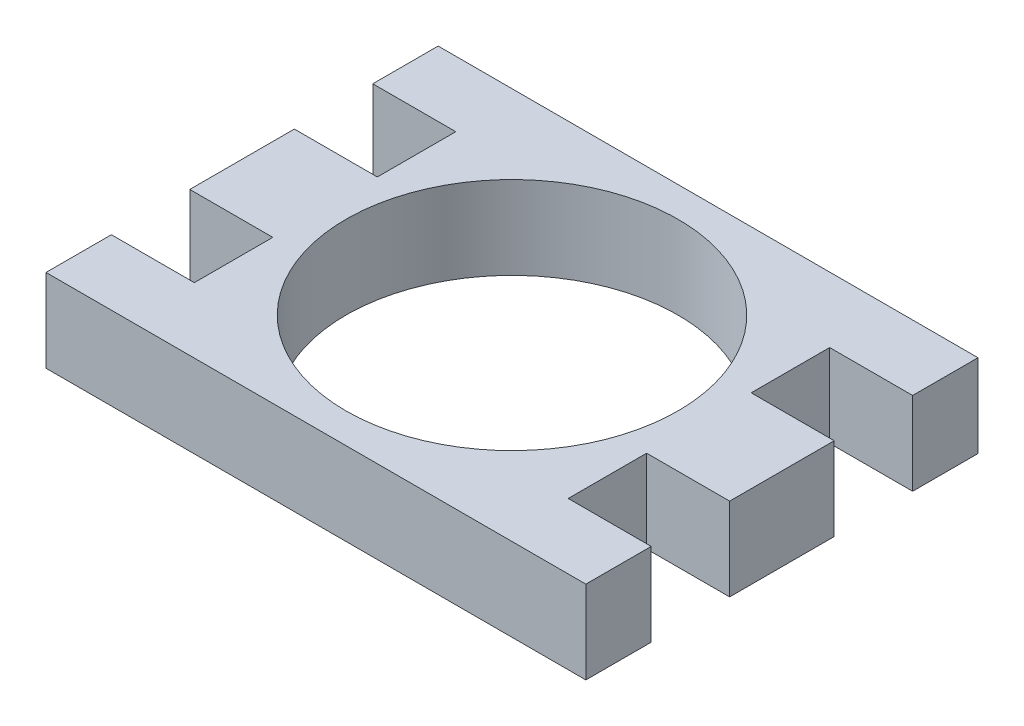
ISO-10303-21;
HEADER;
FILE_DESCRIPTION(('STEP AP214'),'2;1');
FILE_NAME('part.step','',(''),(''),'','','');
FILE_SCHEMA(('AUTOMOTIVE_DESIGN { 1 0 10303 214 1 1 1 1 }'));
ENDSEC;
DATA;
#1=APPLICATION_CONTEXT('core data for automotive mechanical design processes');
#2=APPLICATION_PROTOCOL_DEFINITION('international standard','automotive_design',2000,#1);
#3=PRODUCT_CONTEXT('',#1,'mechanical');
#4=PRODUCT('Part','Part','',(#3));
#5=PRODUCT_RELATED_PRODUCT_CATEGORY('part','',(#4));
#6=PRODUCT_DEFINITION_FORMATION('','',#4);
#7=PRODUCT_DEFINITION_CONTEXT('part definition',#1,'design');
#8=PRODUCT_DEFINITION('design','',#6,#7);
#9=PRODUCT_DEFINITION_SHAPE('','',#8);
#10=(LENGTH_UNIT() NAMED_UNIT(*) SI_UNIT(.MILLI.,.METRE.));
#11=(NAMED_UNIT(*) PLANE_ANGLE_UNIT() SI_UNIT($,.RADIAN.));
#12=(NAMED_UNIT(*) SI_UNIT($,.STERADIAN.) SOLID_ANGLE_UNIT());
#13=UNCERTAINTY_MEASURE_WITH_UNIT(LENGTH_MEASURE(1.E-05),#10,'distance_accuracy_value','');
#14=(GEOMETRIC_REPRESENTATION_CONTEXT(3) GLOBAL_UNCERTAINTY_ASSIGNED_CONTEXT((#13)) GLOBAL_UNIT_ASSIGNED_CONTEXT((#10,
#11,#12)) REPRESENTATION_CONTEXT('',''));
#15=CARTESIAN_POINT('',(0.,0.,0.));
#16=DIRECTION('',(0.,0.,1.));
#17=DIRECTION('',(1.,0.,0.));
#18=AXIS2_PLACEMENT_3D('',#15,#16,#17);
#19=CARTESIAN_POINT('',(0.,6.35,0.));
#20=DIRECTION('',(0.,1.,0.));
#21=DIRECTION('',(0.,0.,1.));
#22=AXIS2_PLACEMENT_3D('',#19,#20,#21);
#23=PLANE('',#22);
#24=DIRECTION('',(0.,0.,-1.));
#25=VECTOR('',#24,1.);
#26=CARTESIAN_POINT('',(20.65,6.35,10.));
#27=LINE('',#26,#25);
#28=CARTESIAN_POINT('',(20.65,6.35,15.));
#29=VERTEX_POINT('',#28);
#30=CARTESIAN_POINT('',(20.65,6.35,10.));
#31=VERTEX_POINT('',#30);
#32=EDGE_CURVE('E241',#29,#31,#27,.T.);
#33=ORIENTED_EDGE('',*,*,#32,.T.);
#34=DIRECTION('',(-1.,0.,0.));
#35=VECTOR('',#34,1.);
#36=CARTESIAN_POINT('',(20.65,6.35,10.));
#37=LINE('',#36,#35);
#38=CARTESIAN_POINT('',(14.3,6.35,9.99999999999999));
#39=VERTEX_POINT('',#38);
#40=EDGE_CURVE('E129',#31,#39,#37,.T.);
#41=ORIENTED_EDGE('',*,*,#40,.T.);
#42=DIRECTION('',(0.,0.,-1.));
#43=VECTOR('',#42,1.);
#44=CARTESIAN_POINT('',(14.3,6.35,9.99999999999999));
#45=LINE('',#44,#43);
#46=CARTESIAN_POINT('',(14.3,6.35,4.));
#47=VERTEX_POINT('',#46);
#48=EDGE_CURVE('E292',#39,#47,#45,.T.);
#49=ORIENTED_EDGE('',*,*,#48,.T.);
#50=DIRECTION('',(1.,0.,0.));
#51=VECTOR('',#50,1.);
#52=CARTESIAN_POINT('',(14.3,6.35,4.));
#53=LINE('',#52,#51);
#54=CARTESIAN_POINT('',(20.65,6.35,4.00000000000001));
#55=VERTEX_POINT('',#54);
#56=EDGE_CURVE('E311',#47,#55,#53,.T.);
#57=ORIENTED_EDGE('',*,*,#56,.T.);
#58=DIRECTION('',(0.,0.,-1.));
#59=VECTOR('',#58,1.);
#60=CARTESIAN_POINT('',(20.65,6.35,-4.00000000000001));
#61=LINE('',#60,#59);
#62=CARTESIAN_POINT('',(20.65,6.35,-4.00000000000001));
#63=VERTEX_POINT('',#62);
#64=EDGE_CURVE('E308',#55,#63,#61,.T.);
#65=ORIENTED_EDGE('',*,*,#64,.T.);
#66=DIRECTION('',(-1.,0.,0.));
#67=VECTOR('',#66,1.);
#68=CARTESIAN_POINT('',(14.3,6.35,-4.));
#69=LINE('',#68,#67);
#70=CARTESIAN_POINT('',(14.3,6.35,-4.));
#71=VERTEX_POINT('',#70);
#72=EDGE_CURVE('E310',#63,#71,#69,.T.);
#73=ORIENTED_EDGE('',*,*,#72,.T.);
#74=DIRECTION('',(0.,0.,-1.));
#75=VECTOR('',#74,1.);
#76=CARTESIAN_POINT('',(14.3,6.35,-9.99999999999999));
#77=LINE('',#76,#75);
#78=CARTESIAN_POINT('',(14.3,6.35,-9.99999999999999));
#79=VERTEX_POINT('',#78);
#80=EDGE_CURVE('E313',#71,#79,#77,.T.);
#81=ORIENTED_EDGE('',*,*,#80,.T.);
#82=DIRECTION('',(1.,0.,0.));
#83=VECTOR('',#82,1.);
#84=CARTESIAN_POINT('',(20.65,6.35,-10.));
#85=LINE('',#84,#83);
#86=CARTESIAN_POINT('',(20.65,6.35,-10.));
#87=VERTEX_POINT('',#86);
#88=EDGE_CURVE('E319',#79,#87,#85,.T.);
#89=ORIENTED_EDGE('',*,*,#88,.T.);
#90=DIRECTION('',(0.,0.,-1.));
#91=VECTOR('',#90,1.);
#92=CARTESIAN_POINT('',(20.65,6.35,-15.));
#93=LINE('',#92,#91);
#94=CARTESIAN_POINT('',(20.65,6.35,-15.));
#95=VERTEX_POINT('',#94);
#96=EDGE_CURVE('E321',#87,#95,#93,.T.);
#97=ORIENTED_EDGE('',*,*,#96,.T.);
#98=DIRECTION('',(-1.,0.,0.));
#99=VECTOR('',#98,1.);
#100=CARTESIAN_POINT('',(-20.65,6.35,-15.));
#101=LINE('',#100,#99);
#102=CARTESIAN_POINT('',(-20.65,6.35,-15.));
#103=VERTEX_POINT('',#102);
#104=EDGE_CURVE('E323',#95,#103,#101,.T.);
#105=ORIENTED_EDGE('',*,*,#104,.T.);
#106=DIRECTION('',(0.,0.,1.));
#107=VECTOR('',#106,1.);
#108=CARTESIAN_POINT('',(-20.65,6.35,-15.));
#109=LINE('',#108,#107);
#110=CARTESIAN_POINT('',(-20.65,6.35,-10.));
#111=VERTEX_POINT('',#110);
#112=EDGE_CURVE('E325',#103,#111,#109,.T.);
#113=ORIENTED_EDGE('',*,*,#112,.T.);
#114=DIRECTION('',(1.,0.,0.));
#115=VECTOR('',#114,1.);
#116=CARTESIAN_POINT('',(-20.65,6.35,-10.));
#117=LINE('',#116,#115);
#118=CARTESIAN_POINT('',(-14.3,6.35,-10.));
#119=VERTEX_POINT('',#118);
#120=EDGE_CURVE('E327',#111,#119,#117,.T.);
#121=ORIENTED_EDGE('',*,*,#120,.T.);
#122=DIRECTION('',(0.,0.,1.));
#123=VECTOR('',#122,1.);
#124=CARTESIAN_POINT('',(-14.3,6.35,-10.));
#125=LINE('',#124,#123);
#126=CARTESIAN_POINT('',(-14.3,6.35,-4.));
#127=VERTEX_POINT('',#126);
#128=EDGE_CURVE('E329',#119,#127,#125,.T.);
#129=ORIENTED_EDGE('',*,*,#128,.T.);
#130=DIRECTION('',(-1.,0.,0.));
#131=VECTOR('',#130,1.);
#132=CARTESIAN_POINT('',(-14.3,6.35,-4.));
#133=LINE('',#132,#131);
#134=CARTESIAN_POINT('',(-20.65,6.35,-4.));
#135=VERTEX_POINT('',#134);
#136=EDGE_CURVE('E331',#127,#135,#133,.T.);
#137=ORIENTED_EDGE('',*,*,#136,.T.);
#138=DIRECTION('',(0.,0.,1.));
#139=VECTOR('',#138,1.);
#140=CARTESIAN_POINT('',(-20.65,6.35,-4.));
#141=LINE('',#140,#139);
#142=CARTESIAN_POINT('',(-20.65,6.35,4.));
#143=VERTEX_POINT('',#142);
#144=EDGE_CURVE('E333',#135,#143,#141,.T.);
#145=ORIENTED_EDGE('',*,*,#144,.T.);
#146=DIRECTION('',(1.,0.,0.));
#147=VECTOR('',#146,1.);
#148=CARTESIAN_POINT('',(-14.3,6.35,4.));
#149=LINE('',#148,#147);
#150=CARTESIAN_POINT('',(-14.3,6.35,4.));
#151=VERTEX_POINT('',#150);
#152=EDGE_CURVE('E335',#143,#151,#149,.T.);
#153=ORIENTED_EDGE('',*,*,#152,.T.);
#154=DIRECTION('',(0.,0.,1.));
#155=VECTOR('',#154,1.);
#156=CARTESIAN_POINT('',(-14.3,6.35,10.));
#157=LINE('',#156,#155);
#158=CARTESIAN_POINT('',(-14.3,6.35,10.));
#159=VERTEX_POINT('',#158);
#160=EDGE_CURVE('E184',#151,#159,#157,.T.);
#161=ORIENTED_EDGE('',*,*,#160,.T.);
#162=DIRECTION('',(-1.,0.,0.));
#163=VECTOR('',#162,1.);
#164=CARTESIAN_POINT('',(-20.65,6.35,10.));
#165=LINE('',#164,#163);
#166=CARTESIAN_POINT('',(-20.65,6.35,10.));
#167=VERTEX_POINT('',#166);
#168=EDGE_CURVE('E178',#159,#167,#165,.T.);
#169=ORIENTED_EDGE('',*,*,#168,.T.);
#170=DIRECTION('',(0.,0.,1.));
#171=VECTOR('',#170,1.);
#172=CARTESIAN_POINT('',(-20.65,6.35,10.));
#173=LINE('',#172,#171);
#174=CARTESIAN_POINT('',(-20.65,6.35,15.));
#175=VERTEX_POINT('',#174);
#176=EDGE_CURVE('E182',#167,#175,#173,.T.);
#177=ORIENTED_EDGE('',*,*,#176,.T.);
#178=DIRECTION('',(1.,0.,0.));
#179=VECTOR('',#178,1.);
#180=CARTESIAN_POINT('',(-20.65,6.35,15.));
#181=LINE('',#180,#179);
#182=EDGE_CURVE('E50',#175,#29,#181,.T.);
#183=ORIENTED_EDGE('',*,*,#182,.T.);
#184=EDGE_LOOP('',(#33,#41,#49,#57,#65,#73,#81,#89,#97,#105,#113,#121,#129,#137,#145,#153,#161,
#169,#177,#183));
#185=FACE_BOUND('',#184,.T.);
#186=CARTESIAN_POINT('',(0.,6.35,0.));
#187=DIRECTION('',(0.,1.,0.));
#188=DIRECTION('',(0.,0.,1.));
#189=AXIS2_PLACEMENT_3D('',#186,#187,#188);
#190=CIRCLE('',#189,12.7);
#191=CARTESIAN_POINT('',(0.,6.35,12.7));
#192=VERTEX_POINT('',#191);
#193=EDGE_CURVE('E206',#192,#192,#190,.T.);
#194=ORIENTED_EDGE('',*,*,#193,.F.);
#195=EDGE_LOOP('',(#194));
#196=FACE_BOUND('',#195,.T.);
#197=ADVANCED_FACE('F33',(#185,#196),#23,.T.);
#198=CARTESIAN_POINT('',(0.,0.,0.));
#199=DIRECTION('',(0.,1.,0.));
#200=DIRECTION('',(0.,0.,1.));
#201=AXIS2_PLACEMENT_3D('',#198,#199,#200);
#202=PLANE('',#201);
#203=DIRECTION('',(0.,0.,-1.));
#204=VECTOR('',#203,1.);
#205=CARTESIAN_POINT('',(20.65,0.,10.));
#206=LINE('',#205,#204);
#207=CARTESIAN_POINT('',(20.65,0.,15.));
#208=VERTEX_POINT('',#207);
#209=CARTESIAN_POINT('',(20.65,0.,10.));
#210=VERTEX_POINT('',#209);
#211=EDGE_CURVE('E202',#208,#210,#206,.T.);
#212=ORIENTED_EDGE('',*,*,#211,.F.);
#213=DIRECTION('',(1.,0.,0.));
#214=VECTOR('',#213,1.);
#215=CARTESIAN_POINT('',(-20.65,0.,15.));
#216=LINE('',#215,#214);
#217=CARTESIAN_POINT('',(-20.65,0.,15.));
#218=VERTEX_POINT('',#217);
#219=EDGE_CURVE('E121',#218,#208,#216,.T.);
#220=ORIENTED_EDGE('',*,*,#219,.F.);
#221=DIRECTION('',(0.,0.,1.));
#222=VECTOR('',#221,1.);
#223=CARTESIAN_POINT('',(-20.65,0.,10.));
#224=LINE('',#223,#222);
#225=CARTESIAN_POINT('',(-20.65,0.,10.));
#226=VERTEX_POINT('',#225);
#227=EDGE_CURVE('E115',#226,#218,#224,.T.);
#228=ORIENTED_EDGE('',*,*,#227,.F.);
#229=DIRECTION('',(-1.,0.,0.));
#230=VECTOR('',#229,1.);
#231=CARTESIAN_POINT('',(-20.65,0.,10.));
#232=LINE('',#231,#230);
#233=CARTESIAN_POINT('',(-14.3,0.,10.));
#234=VERTEX_POINT('',#233);
#235=EDGE_CURVE('E192',#234,#226,#232,.T.);
#236=ORIENTED_EDGE('',*,*,#235,.F.);
#237=DIRECTION('',(0.,0.,1.));
#238=VECTOR('',#237,1.);
#239=CARTESIAN_POINT('',(-14.3,0.,10.));
#240=LINE('',#239,#238);
#241=CARTESIAN_POINT('',(-14.3,0.,4.));
#242=VERTEX_POINT('',#241);
#243=EDGE_CURVE('E236',#242,#234,#240,.T.);
#244=ORIENTED_EDGE('',*,*,#243,.F.);
#245=DIRECTION('',(1.,0.,0.));
#246=VECTOR('',#245,1.);
#247=CARTESIAN_POINT('',(-14.3,0.,4.));
#248=LINE('',#247,#246);
#249=CARTESIAN_POINT('',(-20.65,0.,4.));
#250=VERTEX_POINT('',#249);
#251=EDGE_CURVE('E234',#250,#242,#248,.T.);
#252=ORIENTED_EDGE('',*,*,#251,.F.);
#253=DIRECTION('',(0.,0.,1.));
#254=VECTOR('',#253,1.);
#255=CARTESIAN_POINT('',(-20.65,0.,-4.));
#256=LINE('',#255,#254);
#257=CARTESIAN_POINT('',(-20.65,0.,-4.));
#258=VERTEX_POINT('',#257);
#259=EDGE_CURVE('E232',#258,#250,#256,.T.);
#260=ORIENTED_EDGE('',*,*,#259,.F.);
#261=DIRECTION('',(-1.,0.,0.));
#262=VECTOR('',#261,1.);
#263=CARTESIAN_POINT('',(-14.3,0.,-4.));
#264=LINE('',#263,#262);
#265=CARTESIAN_POINT('',(-14.3,0.,-4.));
#266=VERTEX_POINT('',#265);
#267=EDGE_CURVE('E230',#266,#258,#264,.T.);
#268=ORIENTED_EDGE('',*,*,#267,.F.);
#269=DIRECTION('',(0.,0.,1.));
#270=VECTOR('',#269,1.);
#271=CARTESIAN_POINT('',(-14.3,0.,-10.));
#272=LINE('',#271,#270);
#273=CARTESIAN_POINT('',(-14.3,0.,-10.));
#274=VERTEX_POINT('',#273);
#275=EDGE_CURVE('E228',#274,#266,#272,.T.);
#276=ORIENTED_EDGE('',*,*,#275,.F.);
#277=DIRECTION('',(1.,0.,0.));
#278=VECTOR('',#277,1.);
#279=CARTESIAN_POINT('',(-20.65,0.,-10.));
#280=LINE('',#279,#278);
#281=CARTESIAN_POINT('',(-20.65,0.,-10.));
#282=VERTEX_POINT('',#281);
#283=EDGE_CURVE('E226',#282,#274,#280,.T.);
#284=ORIENTED_EDGE('',*,*,#283,.F.);
#285=DIRECTION('',(0.,0.,1.));
#286=VECTOR('',#285,1.);
#287=CARTESIAN_POINT('',(-20.65,0.,-15.));
#288=LINE('',#287,#286);
#289=CARTESIAN_POINT('',(-20.65,0.,-15.));
#290=VERTEX_POINT('',#289);
#291=EDGE_CURVE('E224',#290,#282,#288,.T.);
#292=ORIENTED_EDGE('',*,*,#291,.F.);
#293=DIRECTION('',(-1.,0.,0.));
#294=VECTOR('',#293,1.);
#295=CARTESIAN_POINT('',(-20.65,0.,-15.));
#296=LINE('',#295,#294);
#297=CARTESIAN_POINT('',(20.65,0.,-15.));
#298=VERTEX_POINT('',#297);
#299=EDGE_CURVE('E222',#298,#290,#296,.T.);
#300=ORIENTED_EDGE('',*,*,#299,.F.);
#301=DIRECTION('',(0.,0.,-1.));
#302=VECTOR('',#301,1.);
#303=CARTESIAN_POINT('',(20.65,0.,-15.));
#304=LINE('',#303,#302);
#305=CARTESIAN_POINT('',(20.65,0.,-10.));
#306=VERTEX_POINT('',#305);
#307=EDGE_CURVE('E220',#306,#298,#304,.T.);
#308=ORIENTED_EDGE('',*,*,#307,.F.);
#309=DIRECTION('',(1.,0.,0.));
#310=VECTOR('',#309,1.);
#311=CARTESIAN_POINT('',(20.65,0.,-10.));
#312=LINE('',#311,#310);
#313=CARTESIAN_POINT('',(14.3,0.,-9.99999999999999));
#314=VERTEX_POINT('',#313);
#315=EDGE_CURVE('E218',#314,#306,#312,.T.);
#316=ORIENTED_EDGE('',*,*,#315,.F.);
#317=DIRECTION('',(0.,0.,-1.));
#318=VECTOR('',#317,1.);
#319=CARTESIAN_POINT('',(14.3,0.,-9.99999999999999));
#320=LINE('',#319,#318);
#321=CARTESIAN_POINT('',(14.3,0.,-4.));
#322=VERTEX_POINT('',#321);
#323=EDGE_CURVE('E216',#322,#314,#320,.T.);
#324=ORIENTED_EDGE('',*,*,#323,.F.);
#325=DIRECTION('',(-1.,0.,0.));
#326=VECTOR('',#325,1.);
#327=CARTESIAN_POINT('',(14.3,0.,-4.));
#328=LINE('',#327,#326);
#329=CARTESIAN_POINT('',(20.65,0.,-4.00000000000001));
#330=VERTEX_POINT('',#329);
#331=EDGE_CURVE('E214',#330,#322,#328,.T.);
#332=ORIENTED_EDGE('',*,*,#331,.F.);
#333=DIRECTION('',(0.,0.,-1.));
#334=VECTOR('',#333,1.);
#335=CARTESIAN_POINT('',(20.65,0.,-4.00000000000001));
#336=LINE('',#335,#334);
#337=CARTESIAN_POINT('',(20.65,0.,4.00000000000001));
#338=VERTEX_POINT('',#337);
#339=EDGE_CURVE('E212',#338,#330,#336,.T.);
#340=ORIENTED_EDGE('',*,*,#339,.F.);
#341=DIRECTION('',(1.,0.,0.));
#342=VECTOR('',#341,1.);
#343=CARTESIAN_POINT('',(14.3,0.,4.));
#344=LINE('',#343,#342);
#345=CARTESIAN_POINT('',(14.3,0.,4.));
#346=VERTEX_POINT('',#345);
#347=EDGE_CURVE('E210',#346,#338,#344,.T.);
#348=ORIENTED_EDGE('',*,*,#347,.F.);
#349=DIRECTION('',(0.,0.,-1.));
#350=VECTOR('',#349,1.);
#351=CARTESIAN_POINT('',(14.3,0.,9.99999999999999));
#352=LINE('',#351,#350);
#353=CARTESIAN_POINT('',(14.3,0.,9.99999999999999));
#354=VERTEX_POINT('',#353);
#355=EDGE_CURVE('E208',#354,#346,#352,.T.);
#356=ORIENTED_EDGE('',*,*,#355,.F.);
#357=DIRECTION('',(-1.,0.,0.));
#358=VECTOR('',#357,1.);
#359=CARTESIAN_POINT('',(20.65,0.,10.));
#360=LINE('',#359,#358);
#361=EDGE_CURVE('E205',#210,#354,#360,.T.);
#362=ORIENTED_EDGE('',*,*,#361,.F.);
#363=EDGE_LOOP('',(#212,#220,#228,#236,#244,#252,#260,#268,#276,#284,#292,#300,#308,#316,#324,
#332,#340,#348,#356,#362));
#364=FACE_BOUND('',#363,.T.);
#365=CARTESIAN_POINT('',(0.,0.,0.));
#366=DIRECTION('',(0.,1.,0.));
#367=DIRECTION('',(0.,0.,1.));
#368=AXIS2_PLACEMENT_3D('',#365,#366,#367);
#369=CIRCLE('',#368,12.7);
#370=CARTESIAN_POINT('',(0.,0.,12.7));
#371=VERTEX_POINT('',#370);
#372=EDGE_CURVE('E586',#371,#371,#369,.T.);
#373=ORIENTED_EDGE('',*,*,#372,.T.);
#374=EDGE_LOOP('',(#373));
#375=FACE_BOUND('',#374,.T.);
#376=ADVANCED_FACE('F296',(#364,#375),#202,.F.);
#377=CARTESIAN_POINT('',(20.65,6.35,10.));
#378=DIRECTION('',(-1.,0.,0.));
#379=DIRECTION('',(0.,0.,1.));
#380=AXIS2_PLACEMENT_3D('',#377,#378,#379);
#381=PLANE('',#380);
#382=ORIENTED_EDGE('',*,*,#211,.T.);
#383=DIRECTION('',(0.,-1.,0.));
#384=VECTOR('',#383,1.);
#385=CARTESIAN_POINT('',(20.65,6.35,10.));
#386=LINE('',#385,#384);
#387=EDGE_CURVE('E11',#31,#210,#386,.T.);
#388=ORIENTED_EDGE('',*,*,#387,.F.);
#389=ORIENTED_EDGE('',*,*,#32,.F.);
#390=DIRECTION('',(0.,-1.,0.));
#391=VECTOR('',#390,1.);
#392=CARTESIAN_POINT('',(20.65,6.35,15.));
#393=LINE('',#392,#391);
#394=EDGE_CURVE('E198',#29,#208,#393,.T.);
#395=ORIENTED_EDGE('',*,*,#394,.T.);
#396=EDGE_LOOP('',(#382,#388,#389,#395));
#397=FACE_BOUND('',#396,.T.);
#398=ADVANCED_FACE('F35',(#397),#381,.F.);
#399=CARTESIAN_POINT('',(20.65,6.35,10.));
#400=DIRECTION('',(0.,0.,1.));
#401=DIRECTION('',(1.,0.,0.));
#402=AXIS2_PLACEMENT_3D('',#399,#400,#401);
#403=PLANE('',#402);
#404=ORIENTED_EDGE('',*,*,#361,.T.);
#405=DIRECTION('',(0.,-1.,0.));
#406=VECTOR('',#405,1.);
#407=CARTESIAN_POINT('',(14.3,6.35,9.99999999999999));
#408=LINE('',#407,#406);
#409=EDGE_CURVE('E42',#39,#354,#408,.T.);
#410=ORIENTED_EDGE('',*,*,#409,.F.);
#411=ORIENTED_EDGE('',*,*,#40,.F.);
#412=ORIENTED_EDGE('',*,*,#387,.T.);
#413=EDGE_LOOP('',(#404,#410,#411,#412));
#414=FACE_BOUND('',#413,.T.);
#415=ADVANCED_FACE('F369',(#414),#403,.F.);
#416=CARTESIAN_POINT('',(14.3,6.35,9.99999999999999));
#417=DIRECTION('',(-1.,0.,0.));
#418=DIRECTION('',(0.,0.,1.));
#419=AXIS2_PLACEMENT_3D('',#416,#417,#418);
#420=PLANE('',#419);
#421=ORIENTED_EDGE('',*,*,#355,.T.);
#422=DIRECTION('',(0.,-1.,0.));
#423=VECTOR('',#422,1.);
#424=CARTESIAN_POINT('',(14.3,6.35,4.));
#425=LINE('',#424,#423);
#426=EDGE_CURVE('E284',#47,#346,#425,.T.);
#427=ORIENTED_EDGE('',*,*,#426,.F.);
#428=ORIENTED_EDGE('',*,*,#48,.F.);
#429=ORIENTED_EDGE('',*,*,#409,.T.);
#430=EDGE_LOOP('',(#421,#427,#428,#429));
#431=FACE_BOUND('',#430,.T.);
#432=ADVANCED_FACE('F290',(#431),#420,.F.);
#433=CARTESIAN_POINT('',(14.3,6.35,4.));
#434=DIRECTION('',(0.,0.,-1.));
#435=DIRECTION('',(-1.,0.,0.));
#436=AXIS2_PLACEMENT_3D('',#433,#434,#435);
#437=PLANE('',#436);
#438=ORIENTED_EDGE('',*,*,#347,.T.);
#439=DIRECTION('',(0.,-1.,0.));
#440=VECTOR('',#439,1.);
#441=CARTESIAN_POINT('',(20.65,6.35,4.00000000000001));
#442=LINE('',#441,#440);
#443=EDGE_CURVE('E281',#55,#338,#442,.T.);
#444=ORIENTED_EDGE('',*,*,#443,.F.);
#445=ORIENTED_EDGE('',*,*,#56,.F.);
#446=ORIENTED_EDGE('',*,*,#426,.T.);
#447=EDGE_LOOP('',(#438,#444,#445,#446));
#448=FACE_BOUND('',#447,.T.);
#449=ADVANCED_FACE('F302',(#448),#437,.F.);
#450=CARTESIAN_POINT('',(20.65,6.35,-4.00000000000001));
#451=DIRECTION('',(-1.,0.,0.));
#452=DIRECTION('',(0.,0.,1.));
#453=AXIS2_PLACEMENT_3D('',#450,#451,#452);
#454=PLANE('',#453);
#455=ORIENTED_EDGE('',*,*,#339,.T.);
#456=DIRECTION('',(0.,-1.,0.));
#457=VECTOR('',#456,1.);
#458=CARTESIAN_POINT('',(20.65,6.35,-4.00000000000001));
#459=LINE('',#458,#457);
#460=EDGE_CURVE('E278',#63,#330,#459,.T.);
#461=ORIENTED_EDGE('',*,*,#460,.F.);
#462=ORIENTED_EDGE('',*,*,#64,.F.);
#463=ORIENTED_EDGE('',*,*,#443,.T.);
#464=EDGE_LOOP('',(#455,#461,#462,#463));
#465=FACE_BOUND('',#464,.T.);
#466=ADVANCED_FACE('F306',(#465),#454,.F.);
#467=CARTESIAN_POINT('',(14.3,6.35,-4.));
#468=DIRECTION('',(0.,0.,1.));
#469=DIRECTION('',(1.,0.,0.));
#470=AXIS2_PLACEMENT_3D('',#467,#468,#469);
#471=PLANE('',#470);
#472=ORIENTED_EDGE('',*,*,#331,.T.);
#473=DIRECTION('',(0.,-1.,0.));
#474=VECTOR('',#473,1.);
#475=CARTESIAN_POINT('',(14.3,6.35,-4.));
#476=LINE('',#475,#474);
#477=EDGE_CURVE('E275',#71,#322,#476,.T.);
#478=ORIENTED_EDGE('',*,*,#477,.F.);
#479=ORIENTED_EDGE('',*,*,#72,.F.);
#480=ORIENTED_EDGE('',*,*,#460,.T.);
#481=EDGE_LOOP('',(#472,#478,#479,#480));
#482=FACE_BOUND('',#481,.T.);
#483=ADVANCED_FACE('F382',(#482),#471,.F.);
#484=CARTESIAN_POINT('',(14.3,6.35,-9.99999999999999));
#485=DIRECTION('',(-1.,0.,0.));
#486=DIRECTION('',(0.,0.,1.));
#487=AXIS2_PLACEMENT_3D('',#484,#485,#486);
#488=PLANE('',#487);
#489=ORIENTED_EDGE('',*,*,#323,.T.);
#490=DIRECTION('',(0.,-1.,0.));
#491=VECTOR('',#490,1.);
#492=CARTESIAN_POINT('',(14.3,6.35,-9.99999999999999));
#493=LINE('',#492,#491);
#494=EDGE_CURVE('E272',#79,#314,#493,.T.);
#495=ORIENTED_EDGE('',*,*,#494,.F.);
#496=ORIENTED_EDGE('',*,*,#80,.F.);
#497=ORIENTED_EDGE('',*,*,#477,.T.);
#498=EDGE_LOOP('',(#489,#495,#496,#497));
#499=FACE_BOUND('',#498,.T.);
#500=ADVANCED_FACE('F385',(#499),#488,.F.);
#501=CARTESIAN_POINT('',(20.65,6.35,-10.));
#502=DIRECTION('',(0.,0.,-1.));
#503=DIRECTION('',(-1.,0.,0.));
#504=AXIS2_PLACEMENT_3D('',#501,#502,#503);
#505=PLANE('',#504);
#506=ORIENTED_EDGE('',*,*,#315,.T.);
#507=DIRECTION('',(0.,-1.,0.));
#508=VECTOR('',#507,1.);
#509=CARTESIAN_POINT('',(20.65,6.35,-10.));
#510=LINE('',#509,#508);
#511=EDGE_CURVE('E269',#87,#306,#510,.T.);
#512=ORIENTED_EDGE('',*,*,#511,.F.);
#513=ORIENTED_EDGE('',*,*,#88,.F.);
#514=ORIENTED_EDGE('',*,*,#494,.T.);
#515=EDGE_LOOP('',(#506,#512,#513,#514));
#516=FACE_BOUND('',#515,.T.);
#517=ADVANCED_FACE('F389',(#516),#505,.F.);
#518=CARTESIAN_POINT('',(20.65,6.35,-15.));
#519=DIRECTION('',(-1.,0.,0.));
#520=DIRECTION('',(0.,0.,1.));
#521=AXIS2_PLACEMENT_3D('',#518,#519,#520);
#522=PLANE('',#521);
#523=ORIENTED_EDGE('',*,*,#307,.T.);
#524=DIRECTION('',(0.,-1.,0.));
#525=VECTOR('',#524,1.);
#526=CARTESIAN_POINT('',(20.65,6.35,-15.));
#527=LINE('',#526,#525);
#528=EDGE_CURVE('E266',#95,#298,#527,.T.);
#529=ORIENTED_EDGE('',*,*,#528,.F.);
#530=ORIENTED_EDGE('',*,*,#96,.F.);
#531=ORIENTED_EDGE('',*,*,#511,.T.);
#532=EDGE_LOOP('',(#523,#529,#530,#531));
#533=FACE_BOUND('',#532,.T.);
#534=ADVANCED_FACE('F393',(#533),#522,.F.);
#535=CARTESIAN_POINT('',(-20.65,6.35,-15.));
#536=DIRECTION('',(0.,0.,1.));
#537=DIRECTION('',(1.,0.,0.));
#538=AXIS2_PLACEMENT_3D('',#535,#536,#537);
#539=PLANE('',#538);
#540=ORIENTED_EDGE('',*,*,#299,.T.);
#541=DIRECTION('',(0.,-1.,0.));
#542=VECTOR('',#541,1.);
#543=CARTESIAN_POINT('',(-20.65,6.35,-15.));
#544=LINE('',#543,#542);
#545=EDGE_CURVE('E263',#103,#290,#544,.T.);
#546=ORIENTED_EDGE('',*,*,#545,.F.);
#547=ORIENTED_EDGE('',*,*,#104,.F.);
#548=ORIENTED_EDGE('',*,*,#528,.T.);
#549=EDGE_LOOP('',(#540,#546,#547,#548));
#550=FACE_BOUND('',#549,.T.);
#551=ADVANCED_FACE('F397',(#550),#539,.F.);
#552=CARTESIAN_POINT('',(-20.65,6.35,-15.));
#553=DIRECTION('',(1.,0.,0.));
#554=DIRECTION('',(0.,0.,-1.));
#555=AXIS2_PLACEMENT_3D('',#552,#553,#554);
#556=PLANE('',#555);
#557=ORIENTED_EDGE('',*,*,#291,.T.);
#558=DIRECTION('',(0.,-1.,0.));
#559=VECTOR('',#558,1.);
#560=CARTESIAN_POINT('',(-20.65,6.35,-10.));
#561=LINE('',#560,#559);
#562=EDGE_CURVE('E260',#111,#282,#561,.T.);
#563=ORIENTED_EDGE('',*,*,#562,.F.);
#564=ORIENTED_EDGE('',*,*,#112,.F.);
#565=ORIENTED_EDGE('',*,*,#545,.T.);
#566=EDGE_LOOP('',(#557,#563,#564,#565));
#567=FACE_BOUND('',#566,.T.);
#568=ADVANCED_FACE('F401',(#567),#556,.F.);
#569=CARTESIAN_POINT('',(-20.65,6.35,-10.));
#570=DIRECTION('',(0.,0.,-1.));
#571=DIRECTION('',(-1.,0.,0.));
#572=AXIS2_PLACEMENT_3D('',#569,#570,#571);
#573=PLANE('',#572);
#574=ORIENTED_EDGE('',*,*,#283,.T.);
#575=DIRECTION('',(0.,-1.,0.));
#576=VECTOR('',#575,1.);
#577=CARTESIAN_POINT('',(-14.3,6.35,-10.));
#578=LINE('',#577,#576);
#579=EDGE_CURVE('E257',#119,#274,#578,.T.);
#580=ORIENTED_EDGE('',*,*,#579,.F.);
#581=ORIENTED_EDGE('',*,*,#120,.F.);
#582=ORIENTED_EDGE('',*,*,#562,.T.);
#583=EDGE_LOOP('',(#574,#580,#581,#582));
#584=FACE_BOUND('',#583,.T.);
#585=ADVANCED_FACE('F405',(#584),#573,.F.);
#586=CARTESIAN_POINT('',(-14.3,6.35,-10.));
#587=DIRECTION('',(1.,0.,0.));
#588=DIRECTION('',(0.,0.,-1.));
#589=AXIS2_PLACEMENT_3D('',#586,#587,#588);
#590=PLANE('',#589);
#591=ORIENTED_EDGE('',*,*,#275,.T.);
#592=DIRECTION('',(0.,-1.,0.));
#593=VECTOR('',#592,1.);
#594=CARTESIAN_POINT('',(-14.3,6.35,-4.));
#595=LINE('',#594,#593);
#596=EDGE_CURVE('E254',#127,#266,#595,.T.);
#597=ORIENTED_EDGE('',*,*,#596,.F.);
#598=ORIENTED_EDGE('',*,*,#128,.F.);
#599=ORIENTED_EDGE('',*,*,#579,.T.);
#600=EDGE_LOOP('',(#591,#597,#598,#599));
#601=FACE_BOUND('',#600,.T.);
#602=ADVANCED_FACE('F409',(#601),#590,.F.);
#603=CARTESIAN_POINT('',(-14.3,6.35,-4.));
#604=DIRECTION('',(0.,0.,1.));
#605=DIRECTION('',(1.,0.,0.));
#606=AXIS2_PLACEMENT_3D('',#603,#604,#605);
#607=PLANE('',#606);
#608=ORIENTED_EDGE('',*,*,#267,.T.);
#609=DIRECTION('',(0.,-1.,0.));
#610=VECTOR('',#609,1.);
#611=CARTESIAN_POINT('',(-20.65,6.35,-4.));
#612=LINE('',#611,#610);
#613=EDGE_CURVE('E251',#135,#258,#612,.T.);
#614=ORIENTED_EDGE('',*,*,#613,.F.);
#615=ORIENTED_EDGE('',*,*,#136,.F.);
#616=ORIENTED_EDGE('',*,*,#596,.T.);
#617=EDGE_LOOP('',(#608,#614,#615,#616));
#618=FACE_BOUND('',#617,.T.);
#619=ADVANCED_FACE('F413',(#618),#607,.F.);
#620=CARTESIAN_POINT('',(-20.65,6.35,-4.));
#621=DIRECTION('',(1.,0.,0.));
#622=DIRECTION('',(0.,0.,-1.));
#623=AXIS2_PLACEMENT_3D('',#620,#621,#622);
#624=PLANE('',#623);
#625=ORIENTED_EDGE('',*,*,#259,.T.);
#626=DIRECTION('',(0.,-1.,0.));
#627=VECTOR('',#626,1.);
#628=CARTESIAN_POINT('',(-20.65,6.35,4.));
#629=LINE('',#628,#627);
#630=EDGE_CURVE('E248',#143,#250,#629,.T.);
#631=ORIENTED_EDGE('',*,*,#630,.F.);
#632=ORIENTED_EDGE('',*,*,#144,.F.);
#633=ORIENTED_EDGE('',*,*,#613,.T.);
#634=EDGE_LOOP('',(#625,#631,#632,#633));
#635=FACE_BOUND('',#634,.T.);
#636=ADVANCED_FACE('F417',(#635),#624,.F.);
#637=CARTESIAN_POINT('',(-14.3,6.35,4.));
#638=DIRECTION('',(0.,0.,-1.));
#639=DIRECTION('',(-1.,0.,0.));
#640=AXIS2_PLACEMENT_3D('',#637,#638,#639);
#641=PLANE('',#640);
#642=ORIENTED_EDGE('',*,*,#251,.T.);
#643=DIRECTION('',(0.,-1.,0.));
#644=VECTOR('',#643,1.);
#645=CARTESIAN_POINT('',(-14.3,6.35,4.));
#646=LINE('',#645,#644);
#647=EDGE_CURVE('E245',#151,#242,#646,.T.);
#648=ORIENTED_EDGE('',*,*,#647,.F.);
#649=ORIENTED_EDGE('',*,*,#152,.F.);
#650=ORIENTED_EDGE('',*,*,#630,.T.);
#651=EDGE_LOOP('',(#642,#648,#649,#650));
#652=FACE_BOUND('',#651,.T.);
#653=ADVANCED_FACE('F341',(#652),#641,.F.);
#654=CARTESIAN_POINT('',(-14.3,6.35,10.));
#655=DIRECTION('',(1.,0.,0.));
#656=DIRECTION('',(0.,0.,-1.));
#657=AXIS2_PLACEMENT_3D('',#654,#655,#656);
#658=PLANE('',#657);
#659=ORIENTED_EDGE('',*,*,#243,.T.);
#660=DIRECTION('',(0.,-1.,0.));
#661=VECTOR('',#660,1.);
#662=CARTESIAN_POINT('',(-14.3,6.35,10.));
#663=LINE('',#662,#661);
#664=EDGE_CURVE('E193',#159,#234,#663,.T.);
#665=ORIENTED_EDGE('',*,*,#664,.F.);
#666=ORIENTED_EDGE('',*,*,#160,.F.);
#667=ORIENTED_EDGE('',*,*,#647,.T.);
#668=EDGE_LOOP('',(#659,#665,#666,#667));
#669=FACE_BOUND('',#668,.T.);
#670=ADVANCED_FACE('F345',(#669),#658,.F.);
#671=CARTESIAN_POINT('',(-20.65,6.35,10.));
#672=DIRECTION('',(0.,0.,1.));
#673=DIRECTION('',(1.,0.,0.));
#674=AXIS2_PLACEMENT_3D('',#671,#672,#673);
#675=PLANE('',#674);
#676=ORIENTED_EDGE('',*,*,#235,.T.);
#677=DIRECTION('',(0.,-1.,0.));
#678=VECTOR('',#677,1.);
#679=CARTESIAN_POINT('',(-20.65,6.35,10.));
#680=LINE('',#679,#678);
#681=EDGE_CURVE('E189',#167,#226,#680,.T.);
#682=ORIENTED_EDGE('',*,*,#681,.F.);
#683=ORIENTED_EDGE('',*,*,#168,.F.);
#684=ORIENTED_EDGE('',*,*,#664,.T.);
#685=EDGE_LOOP('',(#676,#682,#683,#684));
#686=FACE_BOUND('',#685,.T.);
#687=ADVANCED_FACE('F190',(#686),#675,.F.);
#688=CARTESIAN_POINT('',(-20.65,6.35,10.));
#689=DIRECTION('',(1.,0.,0.));
#690=DIRECTION('',(0.,0.,-1.));
#691=AXIS2_PLACEMENT_3D('',#688,#689,#690);
#692=PLANE('',#691);
#693=ORIENTED_EDGE('',*,*,#227,.T.);
#694=DIRECTION('',(0.,-1.,0.));
#695=VECTOR('',#694,1.);
#696=CARTESIAN_POINT('',(-20.65,6.35,15.));
#697=LINE('',#696,#695);
#698=EDGE_CURVE('E194',#175,#218,#697,.T.);
#699=ORIENTED_EDGE('',*,*,#698,.F.);
#700=ORIENTED_EDGE('',*,*,#176,.F.);
#701=ORIENTED_EDGE('',*,*,#681,.T.);
#702=EDGE_LOOP('',(#693,#699,#700,#701));
#703=FACE_BOUND('',#702,.T.);
#704=ADVANCED_FACE('F196',(#703),#692,.F.);
#705=CARTESIAN_POINT('',(-20.65,6.35,15.));
#706=DIRECTION('',(0.,0.,-1.));
#707=DIRECTION('',(-1.,0.,0.));
#708=AXIS2_PLACEMENT_3D('',#705,#706,#707);
#709=PLANE('',#708);
#710=ORIENTED_EDGE('',*,*,#219,.T.);
#711=ORIENTED_EDGE('',*,*,#394,.F.);
#712=ORIENTED_EDGE('',*,*,#182,.F.);
#713=ORIENTED_EDGE('',*,*,#698,.T.);
#714=EDGE_LOOP('',(#710,#711,#712,#713));
#715=FACE_BOUND('',#714,.T.);
#716=ADVANCED_FACE('F349',(#715),#709,.F.);
#717=CARTESIAN_POINT('',(0.,6.35,0.));
#718=DIRECTION('',(0.,-1.,0.));
#719=DIRECTION('',(0.,0.,-1.));
#720=AXIS2_PLACEMENT_3D('',#717,#718,#719);
#721=CYLINDRICAL_SURFACE('',#720,12.7);
#722=ORIENTED_EDGE('',*,*,#193,.T.);
#723=EDGE_LOOP('',(#722));
#724=FACE_BOUND('',#723,.T.);
#725=ORIENTED_EDGE('',*,*,#372,.F.);
#726=EDGE_LOOP('',(#725));
#727=FACE_BOUND('',#726,.T.);
#728=ADVANCED_FACE('F351',(#724,#727),#721,.F.);
#729=CLOSED_SHELL('',(#197,#376,#398,#415,#432,#449,#466,#483,#500,#517,#534,#551,#568,#585,
#602,#619,#636,#653,#670,#687,#704,#716,#728));
#730=MANIFOLD_SOLID_BREP('B2',#729);
#731=ADVANCED_BREP_SHAPE_REPRESENTATION('',(#18,#730),#14);
#732=SHAPE_DEFINITION_REPRESENTATION(#9,#731);
ENDSEC;
END-ISO-10303-21;
